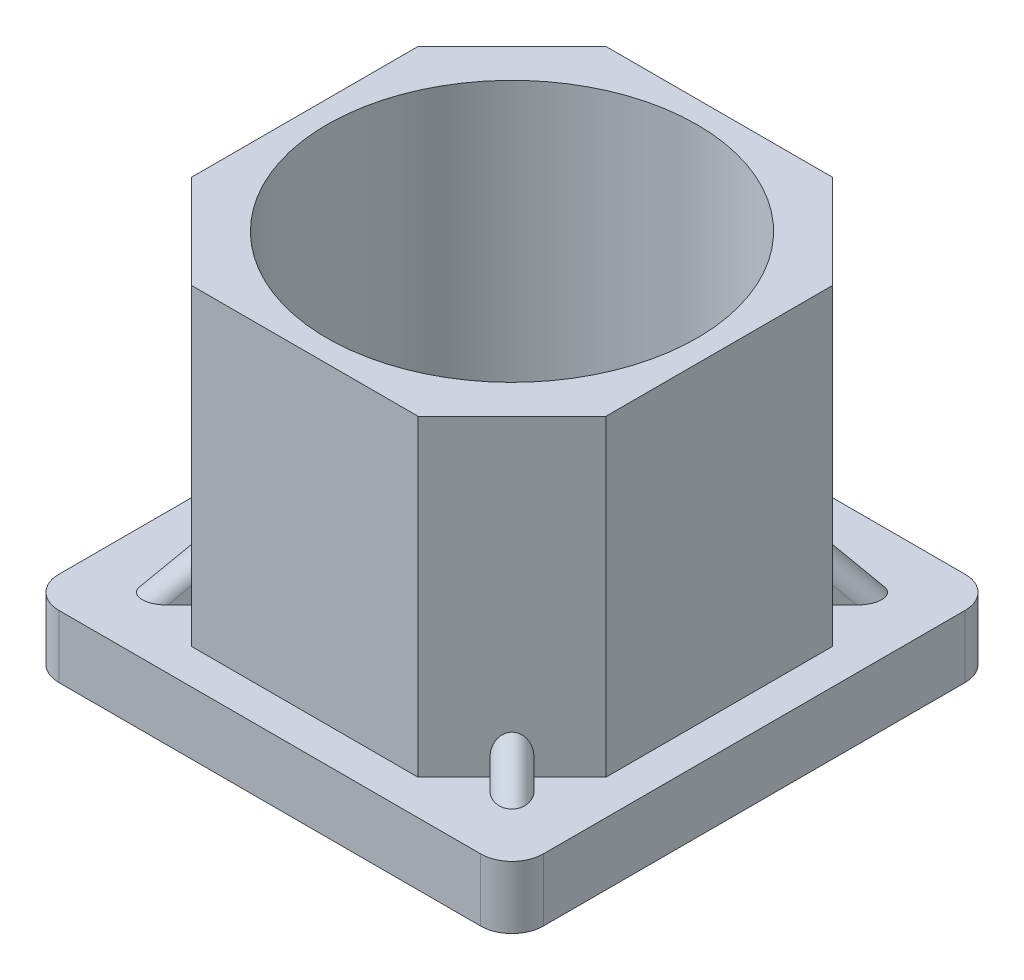
ISO-10303-21;
HEADER;
FILE_DESCRIPTION(('STEP AP214'),'2;1');
FILE_NAME('part.step','',(''),(''),'','','');
FILE_SCHEMA(('AUTOMOTIVE_DESIGN { 1 0 10303 214 1 1 1 1 }'));
ENDSEC;
DATA;
#1=APPLICATION_CONTEXT('core data for automotive mechanical design processes');
#2=APPLICATION_PROTOCOL_DEFINITION('international standard','automotive_design',2000,#1);
#3=PRODUCT_CONTEXT('',#1,'mechanical');
#4=PRODUCT('Part','Part','',(#3));
#5=PRODUCT_RELATED_PRODUCT_CATEGORY('part','',(#4));
#6=PRODUCT_DEFINITION_FORMATION('','',#4);
#7=PRODUCT_DEFINITION_CONTEXT('part definition',#1,'design');
#8=PRODUCT_DEFINITION('design','',#6,#7);
#9=PRODUCT_DEFINITION_SHAPE('','',#8);
#10=(LENGTH_UNIT() NAMED_UNIT(*) SI_UNIT(.MILLI.,.METRE.));
#11=(NAMED_UNIT(*) PLANE_ANGLE_UNIT() SI_UNIT($,.RADIAN.));
#12=(NAMED_UNIT(*) SI_UNIT($,.STERADIAN.) SOLID_ANGLE_UNIT());
#13=UNCERTAINTY_MEASURE_WITH_UNIT(LENGTH_MEASURE(1.E-05),#10,'distance_accuracy_value','');
#14=(GEOMETRIC_REPRESENTATION_CONTEXT(3) GLOBAL_UNCERTAINTY_ASSIGNED_CONTEXT((#13)) GLOBAL_UNIT_ASSIGNED_CONTEXT((#10,
#11,#12)) REPRESENTATION_CONTEXT('',''));
#15=CARTESIAN_POINT('',(0.,0.,0.));
#16=DIRECTION('',(0.,0.,1.));
#17=DIRECTION('',(1.,0.,0.));
#18=AXIS2_PLACEMENT_3D('',#15,#16,#17);
#19=CARTESIAN_POINT('',(-1.41421356237309,0.,1.41421356237309));
#20=DIRECTION('',(0.707106781186548,0.,-0.707106781186548));
#21=DIRECTION('',(-0.707106781186548,0.,-0.707106781186548));
#22=AXIS2_PLACEMENT_3D('',#19,#20,#21);
#23=PLANE('',#22);
#24=DIRECTION('',(0.500000000000015,-0.707106781186548,0.499999999999984));
#25=VECTOR('',#24,1.);
#26=CARTESIAN_POINT('',(16.4332194614999,13.9012115000335,19.2616465862462));
#27=LINE('',#26,#25);
#28=CARTESIAN_POINT('',(19.0753787975412,10.1646339330533,21.9038059222873));
#29=VERTEX_POINT('',#28);
#30=CARTESIAN_POINT('',(20.6060061303897,8.,23.4344332551358));
#31=VERTEX_POINT('',#30);
#32=EDGE_CURVE('E350',#29,#31,#27,.T.);
#33=ORIENTED_EDGE('',*,*,#32,.F.);
#34=DIRECTION('',(0.,-1.,0.));
#35=VECTOR('',#34,1.);
#36=CARTESIAN_POINT('',(19.0753787975412,48.,21.9038059222873));
#37=LINE('',#36,#35);
#38=CARTESIAN_POINT('',(19.0753787975412,8.,21.9038059222873));
#39=VERTEX_POINT('',#38);
#40=EDGE_CURVE('E358',#29,#39,#37,.T.);
#41=ORIENTED_EDGE('',*,*,#40,.T.);
#42=DIRECTION('',(0.707106781186548,0.,0.707106781186548));
#43=VECTOR('',#42,1.);
#44=CARTESIAN_POINT('',(-1.41421356237308,8.,1.41421356237309));
#45=LINE('',#44,#43);
#46=EDGE_CURVE('E341',#39,#31,#45,.T.);
#47=ORIENTED_EDGE('',*,*,#46,.T.);
#48=EDGE_LOOP('',(#33,#41,#47));
#49=FACE_BOUND('',#48,.T.);
#50=ADVANCED_FACE('F150',(#49),#23,.F.);
#51=CARTESIAN_POINT('',(1.4142135623731,0.,-1.4142135623731));
#52=DIRECTION('',(0.707106781186548,0.,-0.707106781186548));
#53=DIRECTION('',(-0.707106781186548,0.,-0.707106781186548));
#54=AXIS2_PLACEMENT_3D('',#51,#52,#53);
#55=PLANE('',#54);
#56=DIRECTION('',(0.,-1.,0.));
#57=VECTOR('',#56,1.);
#58=CARTESIAN_POINT('',(21.9038059222873,48.,19.0753787975411));
#59=LINE('',#58,#57);
#60=CARTESIAN_POINT('',(21.9038059222872,10.1646339330534,19.0753787975411));
#61=VERTEX_POINT('',#60);
#62=CARTESIAN_POINT('',(21.9038059222873,8.,19.0753787975411));
#63=VERTEX_POINT('',#62);
#64=EDGE_CURVE('E562',#61,#63,#59,.T.);
#65=ORIENTED_EDGE('',*,*,#64,.F.);
#66=DIRECTION('',(0.500000000000015,-0.707106781186548,0.499999999999984));
#67=VECTOR('',#66,1.);
#68=CARTESIAN_POINT('',(19.261646586246,13.9012115000336,16.4332194615));
#69=LINE('',#68,#67);
#70=CARTESIAN_POINT('',(23.4344332551359,8.,20.6060061303897));
#71=VERTEX_POINT('',#70);
#72=EDGE_CURVE('E693',#61,#71,#69,.T.);
#73=ORIENTED_EDGE('',*,*,#72,.T.);
#74=DIRECTION('',(0.707106781186548,0.,0.707106781186548));
#75=VECTOR('',#74,1.);
#76=CARTESIAN_POINT('',(1.4142135623731,8.,-1.4142135623731));
#77=LINE('',#76,#75);
#78=EDGE_CURVE('E344',#63,#71,#77,.T.);
#79=ORIENTED_EDGE('',*,*,#78,.F.);
#80=EDGE_LOOP('',(#65,#73,#79));
#81=FACE_BOUND('',#80,.T.);
#82=ADVANCED_FACE('F692',(#81),#55,.T.);
#83=CARTESIAN_POINT('',(-26.99,8.,26.99));
#84=DIRECTION('',(0.,-1.,0.));
#85=DIRECTION('',(0.,0.,-1.));
#86=AXIS2_PLACEMENT_3D('',#83,#84,#85);
#87=PLANE('',#86);
#88=CARTESIAN_POINT('',(22.0202196927625,8.,22.0202196927629));
#89=DIRECTION('',(0.,-1.,0.));
#90=DIRECTION('',(-0.707106781186569,0.,-0.707106781186526));
#91=AXIS2_PLACEMENT_3D('',#88,#89,#90);
#92=ELLIPSE('',#91,2.82842712474614,1.99999999999997);
#93=EDGE_CURVE('E336',#71,#31,#92,.T.);
#94=ORIENTED_EDGE('',*,*,#93,.T.);
#95=ORIENTED_EDGE('',*,*,#46,.F.);
#96=DIRECTION('',(0.707106781186526,0.,-0.707106781186569));
#97=VECTOR('',#96,1.);
#98=CARTESIAN_POINT('',(26.4999999999998,8.,14.4791847198283));
#99=LINE('',#98,#97);
#100=CARTESIAN_POINT('',(14.4791847198288,8.,26.5));
#101=VERTEX_POINT('',#100);
#102=EDGE_CURVE('E416',#101,#39,#99,.T.);
#103=ORIENTED_EDGE('',*,*,#102,.F.);
#104=DIRECTION('',(1.,0.,0.));
#105=VECTOR('',#104,1.);
#106=CARTESIAN_POINT('',(-14.4791847198286,8.,26.5));
#107=LINE('',#106,#105);
#108=CARTESIAN_POINT('',(-14.4791847198286,8.,26.5));
#109=VERTEX_POINT('',#108);
#110=EDGE_CURVE('E411',#109,#101,#107,.T.);
#111=ORIENTED_EDGE('',*,*,#110,.F.);
#112=DIRECTION('',(0.70710678118655,0.,0.707106781186545));
#113=VECTOR('',#112,1.);
#114=CARTESIAN_POINT('',(-14.4791847198286,8.,26.5));
#115=LINE('',#114,#113);
#116=CARTESIAN_POINT('',(-19.0753787975409,8.,21.9038059222877));
#117=VERTEX_POINT('',#116);
#118=EDGE_CURVE('E406',#117,#109,#115,.T.);
#119=ORIENTED_EDGE('',*,*,#118,.F.);
#120=DIRECTION('',(-0.707106781186536,0.,0.707106781186559));
#121=VECTOR('',#120,1.);
#122=CARTESIAN_POINT('',(-25.5757864376265,8.,28.4042135623735));
#123=LINE('',#122,#121);
#124=CARTESIAN_POINT('',(-20.6097393284398,8.,23.4381664531867));
#125=VERTEX_POINT('',#124);
#126=EDGE_CURVE('E635',#117,#125,#123,.T.);
#127=ORIENTED_EDGE('',*,*,#126,.T.);
#128=CARTESIAN_POINT('',(-22.0239528908132,8.,22.0239528908134));
#129=DIRECTION('',(0.,-1.,0.));
#130=DIRECTION('',(0.707106781186545,0.,-0.70710678118655));
#131=AXIS2_PLACEMENT_3D('',#128,#129,#130);
#132=ELLIPSE('',#131,2.82842712474621,2.00000000000001);
#133=CARTESIAN_POINT('',(-23.4381664531861,8.,20.6097393284405));
#134=VERTEX_POINT('',#133);
#135=EDGE_CURVE('E167',#134,#125,#132,.F.);
#136=ORIENTED_EDGE('',*,*,#135,.F.);
#137=DIRECTION('',(-0.707106781186536,0.,0.707106781186559));
#138=VECTOR('',#137,1.);
#139=CARTESIAN_POINT('',(-28.4042135623727,8.,25.5757864376273));
#140=LINE('',#139,#138);
#141=CARTESIAN_POINT('',(-21.9038059222871,8.,19.0753787975416));
#142=VERTEX_POINT('',#141);
#143=EDGE_CURVE('E631',#142,#134,#140,.T.);
#144=ORIENTED_EDGE('',*,*,#143,.F.);
#145=CARTESIAN_POINT('',(-26.5,8.,14.4791847198287));
#146=VERTEX_POINT('',#145);
#147=EDGE_CURVE('E407',#146,#142,#115,.T.);
#148=ORIENTED_EDGE('',*,*,#147,.F.);
#149=DIRECTION('',(0.,0.,1.));
#150=VECTOR('',#149,1.);
#151=CARTESIAN_POINT('',(-26.5,8.,14.4791847198287));
#152=LINE('',#151,#150);
#153=CARTESIAN_POINT('',(-26.5,8.,-14.4791847198287));
#154=VERTEX_POINT('',#153);
#155=EDGE_CURVE('E402',#154,#146,#152,.T.);
#156=ORIENTED_EDGE('',*,*,#155,.F.);
#157=DIRECTION('',(-0.707106781186548,0.,0.707106781186548));
#158=VECTOR('',#157,1.);
#159=CARTESIAN_POINT('',(-26.5,8.,-14.4791847198287));
#160=LINE('',#159,#158);
#161=CARTESIAN_POINT('',(-21.9038059222875,8.,-19.0753787975413));
#162=VERTEX_POINT('',#161);
#163=EDGE_CURVE('E432',#162,#154,#160,.T.);
#164=ORIENTED_EDGE('',*,*,#163,.F.);
#165=DIRECTION('',(-0.707106781186548,0.,-0.707106781186547));
#166=VECTOR('',#165,1.);
#167=CARTESIAN_POINT('',(-26.8535533905933,8.,-24.0251262658471));
#168=LINE('',#167,#166);
#169=CARTESIAN_POINT('',(-23.1591134094628,8.,-20.3306862847166));
#170=VERTEX_POINT('',#169);
#171=EDGE_CURVE('E372',#162,#170,#168,.T.);
#172=ORIENTED_EDGE('',*,*,#171,.T.);
#173=CARTESIAN_POINT('',(-21.6452395452023,8.,-21.6452395452023));
#174=DIRECTION('',(0.,-1.,0.));
#175=DIRECTION('',(0.707106781186547,0.,0.707106781186548));
#176=AXIS2_PLACEMENT_3D('',#173,#174,#175);
#177=ELLIPSE('',#176,2.83193650203267,2.00248150447701);
#178=CARTESIAN_POINT('',(-20.3306862847187,8.,-23.1591134094649));
#179=VERTEX_POINT('',#178);
#180=EDGE_CURVE('E654',#179,#170,#177,.F.);
#181=ORIENTED_EDGE('',*,*,#180,.F.);
#182=DIRECTION('',(-0.707106781186548,0.,-0.707106781186547));
#183=VECTOR('',#182,1.);
#184=CARTESIAN_POINT('',(-24.0251262658471,8.,-26.8535533905933));
#185=LINE('',#184,#183);
#186=CARTESIAN_POINT('',(-19.0753787975413,8.,-21.9038059222874));
#187=VERTEX_POINT('',#186);
#188=EDGE_CURVE('E361',#187,#179,#185,.T.);
#189=ORIENTED_EDGE('',*,*,#188,.F.);
#190=CARTESIAN_POINT('',(-14.4791847198287,8.,-26.5));
#191=VERTEX_POINT('',#190);
#192=EDGE_CURVE('E380',#191,#187,#160,.T.);
#193=ORIENTED_EDGE('',*,*,#192,.F.);
#194=DIRECTION('',(-1.,0.,0.));
#195=VECTOR('',#194,1.);
#196=CARTESIAN_POINT('',(-14.4791847198287,8.,-26.5));
#197=LINE('',#196,#195);
#198=CARTESIAN_POINT('',(14.4791847198285,8.,-26.5));
#199=VERTEX_POINT('',#198);
#200=EDGE_CURVE('E428',#199,#191,#197,.T.);
#201=ORIENTED_EDGE('',*,*,#200,.F.);
#202=DIRECTION('',(-0.707106781186546,0.,-0.70710678118655));
#203=VECTOR('',#202,1.);
#204=CARTESIAN_POINT('',(14.4791847198285,8.,-26.5));
#205=LINE('',#204,#203);
#206=CARTESIAN_POINT('',(19.0753787975408,8.,-21.9038059222876));
#207=VERTEX_POINT('',#206);
#208=EDGE_CURVE('E423',#207,#199,#205,.T.);
#209=ORIENTED_EDGE('',*,*,#208,.F.);
#210=DIRECTION('',(0.707106781186537,0.,-0.707106781186558));
#211=VECTOR('',#210,1.);
#212=CARTESIAN_POINT('',(-28.4042135623727,8.,25.5757864376273));
#213=LINE('',#212,#211);
#214=CARTESIAN_POINT('',(20.6579585078633,8.,-23.4863856326102));
#215=VERTEX_POINT('',#214);
#216=EDGE_CURVE('E584',#207,#215,#213,.T.);
#217=ORIENTED_EDGE('',*,*,#216,.T.);
#218=CARTESIAN_POINT('',(22.0233572580345,8.,-22.0233572580343));
#219=DIRECTION('',(0.,-1.,0.));
#220=DIRECTION('',(-0.70710678118655,0.,0.707106781186546));
#221=AXIS2_PLACEMENT_3D('',#218,#219,#220);
#222=ELLIPSE('',#221,2.82926947669985,2.00059563277858);
#223=CARTESIAN_POINT('',(23.4863856326564,8.,-20.6579585079108));
#224=VERTEX_POINT('',#223);
#225=EDGE_CURVE('E174',#224,#215,#222,.F.);
#226=ORIENTED_EDGE('',*,*,#225,.F.);
#227=DIRECTION('',(0.707106781186537,0.,-0.707106781186558));
#228=VECTOR('',#227,1.);
#229=CARTESIAN_POINT('',(-25.5757864376265,8.,28.4042135623735));
#230=LINE('',#229,#228);
#231=CARTESIAN_POINT('',(21.903805922287,8.,-19.0753787975415));
#232=VERTEX_POINT('',#231);
#233=EDGE_CURVE('E588',#232,#224,#230,.T.);
#234=ORIENTED_EDGE('',*,*,#233,.F.);
#235=CARTESIAN_POINT('',(26.4999999999998,8.,-14.4791847198287));
#236=VERTEX_POINT('',#235);
#237=EDGE_CURVE('E424',#236,#232,#205,.T.);
#238=ORIENTED_EDGE('',*,*,#237,.F.);
#239=DIRECTION('',(0.,0.,-1.));
#240=VECTOR('',#239,1.);
#241=CARTESIAN_POINT('',(26.4999999999998,8.,14.4791847198283));
#242=LINE('',#241,#240);
#243=CARTESIAN_POINT('',(26.4999999999998,8.,14.4791847198283));
#244=VERTEX_POINT('',#243);
#245=EDGE_CURVE('E419',#244,#236,#242,.T.);
#246=ORIENTED_EDGE('',*,*,#245,.F.);
#247=EDGE_CURVE('E415',#63,#244,#99,.T.);
#248=ORIENTED_EDGE('',*,*,#247,.F.);
#249=ORIENTED_EDGE('',*,*,#78,.T.);
#250=EDGE_LOOP('',(#94,#95,#103,#111,#119,#127,#136,#144,#148,#156,#164,#172,#181,#189,#193,
#201,#209,#217,#226,#234,#238,#246,#248,#249));
#251=FACE_BOUND('',#250,.T.);
#252=CARTESIAN_POINT('',(-26.99,8.,26.99));
#253=DIRECTION('',(0.,1.,0.));
#254=DIRECTION('',(0.,0.,-1.));
#255=AXIS2_PLACEMENT_3D('',#252,#253,#254);
#256=CIRCLE('',#255,4.);
#257=CARTESIAN_POINT('',(-30.99,8.,26.99));
#258=VERTEX_POINT('',#257);
#259=CARTESIAN_POINT('',(-26.99,8.,30.99));
#260=VERTEX_POINT('',#259);
#261=EDGE_CURVE('E468',#258,#260,#256,.T.);
#262=ORIENTED_EDGE('',*,*,#261,.T.);
#263=DIRECTION('',(1.,0.,0.));
#264=VECTOR('',#263,1.);
#265=CARTESIAN_POINT('',(-26.99,8.,30.99));
#266=LINE('',#265,#264);
#267=CARTESIAN_POINT('',(26.99,8.,30.99));
#268=VERTEX_POINT('',#267);
#269=EDGE_CURVE('E472',#260,#268,#266,.T.);
#270=ORIENTED_EDGE('',*,*,#269,.T.);
#271=CARTESIAN_POINT('',(26.99,8.,26.99));
#272=DIRECTION('',(0.,1.,0.));
#273=DIRECTION('',(0.,0.,1.));
#274=AXIS2_PLACEMENT_3D('',#271,#272,#273);
#275=CIRCLE('',#274,3.99999999999999);
#276=CARTESIAN_POINT('',(30.99,8.,26.99));
#277=VERTEX_POINT('',#276);
#278=EDGE_CURVE('E476',#268,#277,#275,.T.);
#279=ORIENTED_EDGE('',*,*,#278,.T.);
#280=DIRECTION('',(0.,0.,-1.));
#281=VECTOR('',#280,1.);
#282=CARTESIAN_POINT('',(30.99,8.,26.99));
#283=LINE('',#282,#281);
#284=CARTESIAN_POINT('',(30.99,8.,-26.99));
#285=VERTEX_POINT('',#284);
#286=EDGE_CURVE('E479',#277,#285,#283,.T.);
#287=ORIENTED_EDGE('',*,*,#286,.T.);
#288=CARTESIAN_POINT('',(26.99,8.,-26.99));
#289=DIRECTION('',(0.,1.,0.));
#290=DIRECTION('',(0.,0.,-1.));
#291=AXIS2_PLACEMENT_3D('',#288,#289,#290);
#292=CIRCLE('',#291,4.);
#293=CARTESIAN_POINT('',(26.99,8.,-30.99));
#294=VERTEX_POINT('',#293);
#295=EDGE_CURVE('E482',#285,#294,#292,.T.);
#296=ORIENTED_EDGE('',*,*,#295,.T.);
#297=DIRECTION('',(-1.,0.,0.));
#298=VECTOR('',#297,1.);
#299=CARTESIAN_POINT('',(-26.99,8.,-30.99));
#300=LINE('',#299,#298);
#301=CARTESIAN_POINT('',(-26.99,8.,-30.99));
#302=VERTEX_POINT('',#301);
#303=EDGE_CURVE('E485',#294,#302,#300,.T.);
#304=ORIENTED_EDGE('',*,*,#303,.T.);
#305=CARTESIAN_POINT('',(-26.99,8.,-26.99));
#306=DIRECTION('',(0.,1.,0.));
#307=DIRECTION('',(0.,0.,-1.));
#308=AXIS2_PLACEMENT_3D('',#305,#306,#307);
#309=CIRCLE('',#308,4.);
#310=CARTESIAN_POINT('',(-30.99,8.,-26.99));
#311=VERTEX_POINT('',#310);
#312=EDGE_CURVE('E488',#302,#311,#309,.T.);
#313=ORIENTED_EDGE('',*,*,#312,.T.);
#314=DIRECTION('',(0.,0.,1.));
#315=VECTOR('',#314,1.);
#316=CARTESIAN_POINT('',(-30.99,8.,26.99));
#317=LINE('',#316,#315);
#318=EDGE_CURVE('E491',#311,#258,#317,.T.);
#319=ORIENTED_EDGE('',*,*,#318,.T.);
#320=EDGE_LOOP('',(#262,#270,#279,#287,#296,#304,#313,#319));
#321=FACE_BOUND('',#320,.T.);
#322=ADVANCED_FACE('F338',(#251,#321),#87,.F.);
#323=CARTESIAN_POINT('',(14.4791847198285,48.,-26.5));
#324=DIRECTION('',(-0.70710678118655,0.,0.707106781186546));
#325=DIRECTION('',(0.707106781186546,0.,0.70710678118655));
#326=AXIS2_PLACEMENT_3D('',#323,#324,#325);
#327=PLANE('',#326);
#328=CARTESIAN_POINT('',(20.4895923599143,10.1690711204133,-20.4895923599142));
#329=DIRECTION('',(-0.70710678118655,0.,0.707106781186546));
#330=DIRECTION('',(0.,-1.,0.));
#331=AXIS2_PLACEMENT_3D('',#328,#329,#330);
#332=ELLIPSE('',#331,2.82926947669985,2.00059563277858);
#333=CARTESIAN_POINT('',(21.903805922287,10.2381056899408,-19.0753787975415));
#334=VERTEX_POINT('',#333);
#335=CARTESIAN_POINT('',(19.0753787975408,10.2381056898746,-21.9038059222877));
#336=VERTEX_POINT('',#335);
#337=EDGE_CURVE('E580',#334,#336,#332,.T.);
#338=ORIENTED_EDGE('',*,*,#337,.T.);
#339=DIRECTION('',(0.,-1.,0.));
#340=VECTOR('',#339,1.);
#341=CARTESIAN_POINT('',(19.0753787975408,48.,-21.9038059222877));
#342=LINE('',#341,#340);
#343=EDGE_CURVE('E160',#336,#207,#342,.T.);
#344=ORIENTED_EDGE('',*,*,#343,.T.);
#345=ORIENTED_EDGE('',*,*,#208,.T.);
#346=DIRECTION('',(0.,-1.,0.));
#347=VECTOR('',#346,1.);
#348=CARTESIAN_POINT('',(14.4791847198285,48.,-26.5));
#349=LINE('',#348,#347);
#350=CARTESIAN_POINT('',(14.4791847198285,48.,-26.5));
#351=VERTEX_POINT('',#350);
#352=EDGE_CURVE('E443',#351,#199,#349,.T.);
#353=ORIENTED_EDGE('',*,*,#352,.F.);
#354=DIRECTION('',(-0.707106781186546,0.,-0.70710678118655));
#355=VECTOR('',#354,1.);
#356=CARTESIAN_POINT('',(14.4791847198285,48.,-26.5));
#357=LINE('',#356,#355);
#358=CARTESIAN_POINT('',(26.4999999999998,48.,-14.4791847198287));
#359=VERTEX_POINT('',#358);
#360=EDGE_CURVE('E392',#359,#351,#357,.T.);
#361=ORIENTED_EDGE('',*,*,#360,.F.);
#362=DIRECTION('',(0.,-1.,0.));
#363=VECTOR('',#362,1.);
#364=CARTESIAN_POINT('',(26.4999999999998,48.,-14.4791847198287));
#365=LINE('',#364,#363);
#366=EDGE_CURVE('E447',#359,#236,#365,.T.);
#367=ORIENTED_EDGE('',*,*,#366,.T.);
#368=ORIENTED_EDGE('',*,*,#237,.T.);
#369=DIRECTION('',(0.,-1.,0.));
#370=VECTOR('',#369,1.);
#371=CARTESIAN_POINT('',(21.903805922287,48.,-19.0753787975415));
#372=LINE('',#371,#370);
#373=EDGE_CURVE('E12',#334,#232,#372,.T.);
#374=ORIENTED_EDGE('',*,*,#373,.F.);
#375=EDGE_LOOP('',(#338,#344,#345,#353,#361,#367,#368,#374));
#376=FACE_BOUND('',#375,.T.);
#377=ADVANCED_FACE('F575',(#376),#327,.F.);
#378=CARTESIAN_POINT('',(-26.99,8.,26.99));
#379=DIRECTION('',(0.,-1.,0.));
#380=DIRECTION('',(0.,0.,-1.));
#381=AXIS2_PLACEMENT_3D('',#378,#379,#380);
#382=CYLINDRICAL_SURFACE('',#381,4.);
#383=CARTESIAN_POINT('',(-26.99,0.,26.99));
#384=DIRECTION('',(0.,1.,0.));
#385=DIRECTION('',(0.,0.,-1.));
#386=AXIS2_PLACEMENT_3D('',#383,#384,#385);
#387=CIRCLE('',#386,4.);
#388=CARTESIAN_POINT('',(-30.99,0.,26.99));
#389=VERTEX_POINT('',#388);
#390=CARTESIAN_POINT('',(-26.99,0.,30.99));
#391=VERTEX_POINT('',#390);
#392=EDGE_CURVE('E467',#389,#391,#387,.T.);
#393=ORIENTED_EDGE('',*,*,#392,.T.);
#394=DIRECTION('',(0.,-1.,0.));
#395=VECTOR('',#394,1.);
#396=CARTESIAN_POINT('',(-26.99,8.,30.99));
#397=LINE('',#396,#395);
#398=EDGE_CURVE('E545',#260,#391,#397,.T.);
#399=ORIENTED_EDGE('',*,*,#398,.F.);
#400=ORIENTED_EDGE('',*,*,#261,.F.);
#401=DIRECTION('',(0.,-1.,0.));
#402=VECTOR('',#401,1.);
#403=CARTESIAN_POINT('',(-30.99,8.,26.99));
#404=LINE('',#403,#402);
#405=EDGE_CURVE('E494',#258,#389,#404,.T.);
#406=ORIENTED_EDGE('',*,*,#405,.T.);
#407=EDGE_LOOP('',(#393,#399,#400,#406));
#408=FACE_BOUND('',#407,.T.);
#409=ADVANCED_FACE('F989',(#408),#382,.T.);
#410=CARTESIAN_POINT('',(-26.99,8.,30.99));
#411=DIRECTION('',(0.,0.,-1.));
#412=DIRECTION('',(-1.,0.,0.));
#413=AXIS2_PLACEMENT_3D('',#410,#411,#412);
#414=PLANE('',#413);
#415=DIRECTION('',(1.,0.,0.));
#416=VECTOR('',#415,1.);
#417=CARTESIAN_POINT('',(-26.99,0.,30.99));
#418=LINE('',#417,#416);
#419=CARTESIAN_POINT('',(26.99,0.,30.99));
#420=VERTEX_POINT('',#419);
#421=EDGE_CURVE('E498',#391,#420,#418,.T.);
#422=ORIENTED_EDGE('',*,*,#421,.T.);
#423=DIRECTION('',(0.,-1.,0.));
#424=VECTOR('',#423,1.);
#425=CARTESIAN_POINT('',(26.99,8.,30.99));
#426=LINE('',#425,#424);
#427=EDGE_CURVE('E541',#268,#420,#426,.T.);
#428=ORIENTED_EDGE('',*,*,#427,.F.);
#429=ORIENTED_EDGE('',*,*,#269,.F.);
#430=ORIENTED_EDGE('',*,*,#398,.T.);
#431=EDGE_LOOP('',(#422,#428,#429,#430));
#432=FACE_BOUND('',#431,.T.);
#433=ADVANCED_FACE('F1106',(#432),#414,.F.);
#434=CARTESIAN_POINT('',(26.99,8.,26.99));
#435=DIRECTION('',(0.,-1.,0.));
#436=DIRECTION('',(0.,0.,-1.));
#437=AXIS2_PLACEMENT_3D('',#434,#435,#436);
#438=CYLINDRICAL_SURFACE('',#437,3.99999999999999);
#439=CARTESIAN_POINT('',(26.99,0.,26.99));
#440=DIRECTION('',(0.,1.,0.));
#441=DIRECTION('',(0.,0.,1.));
#442=AXIS2_PLACEMENT_3D('',#439,#440,#441);
#443=CIRCLE('',#442,3.99999999999999);
#444=CARTESIAN_POINT('',(30.99,0.,26.99));
#445=VERTEX_POINT('',#444);
#446=EDGE_CURVE('E501',#420,#445,#443,.T.);
#447=ORIENTED_EDGE('',*,*,#446,.T.);
#448=DIRECTION('',(0.,-1.,0.));
#449=VECTOR('',#448,1.);
#450=CARTESIAN_POINT('',(30.99,8.,26.99));
#451=LINE('',#450,#449);
#452=EDGE_CURVE('E537',#277,#445,#451,.T.);
#453=ORIENTED_EDGE('',*,*,#452,.F.);
#454=ORIENTED_EDGE('',*,*,#278,.F.);
#455=ORIENTED_EDGE('',*,*,#427,.T.);
#456=EDGE_LOOP('',(#447,#453,#454,#455));
#457=FACE_BOUND('',#456,.T.);
#458=ADVANCED_FACE('F1095',(#457),#438,.T.);
#459=CARTESIAN_POINT('',(30.99,8.,26.99));
#460=DIRECTION('',(-1.,0.,0.));
#461=DIRECTION('',(0.,0.,1.));
#462=AXIS2_PLACEMENT_3D('',#459,#460,#461);
#463=PLANE('',#462);
#464=DIRECTION('',(0.,0.,-1.));
#465=VECTOR('',#464,1.);
#466=CARTESIAN_POINT('',(30.99,0.,26.99));
#467=LINE('',#466,#465);
#468=CARTESIAN_POINT('',(30.99,0.,-26.99));
#469=VERTEX_POINT('',#468);
#470=EDGE_CURVE('E504',#445,#469,#467,.T.);
#471=ORIENTED_EDGE('',*,*,#470,.T.);
#472=DIRECTION('',(0.,-1.,0.));
#473=VECTOR('',#472,1.);
#474=CARTESIAN_POINT('',(30.99,8.,-26.99));
#475=LINE('',#474,#473);
#476=EDGE_CURVE('E533',#285,#469,#475,.T.);
#477=ORIENTED_EDGE('',*,*,#476,.F.);
#478=ORIENTED_EDGE('',*,*,#286,.F.);
#479=ORIENTED_EDGE('',*,*,#452,.T.);
#480=EDGE_LOOP('',(#471,#477,#478,#479));
#481=FACE_BOUND('',#480,.T.);
#482=ADVANCED_FACE('F1084',(#481),#463,.F.);
#483=CARTESIAN_POINT('',(26.99,8.,-26.99));
#484=DIRECTION('',(0.,-1.,0.));
#485=DIRECTION('',(0.,0.,-1.));
#486=AXIS2_PLACEMENT_3D('',#483,#484,#485);
#487=CYLINDRICAL_SURFACE('',#486,4.);
#488=CARTESIAN_POINT('',(26.99,0.,-26.99));
#489=DIRECTION('',(0.,1.,0.));
#490=DIRECTION('',(0.,0.,-1.));
#491=AXIS2_PLACEMENT_3D('',#488,#489,#490);
#492=CIRCLE('',#491,4.);
#493=CARTESIAN_POINT('',(26.99,0.,-30.99));
#494=VERTEX_POINT('',#493);
#495=EDGE_CURVE('E507',#469,#494,#492,.T.);
#496=ORIENTED_EDGE('',*,*,#495,.T.);
#497=DIRECTION('',(0.,-1.,0.));
#498=VECTOR('',#497,1.);
#499=CARTESIAN_POINT('',(26.99,8.,-30.99));
#500=LINE('',#499,#498);
#501=EDGE_CURVE('E529',#294,#494,#500,.T.);
#502=ORIENTED_EDGE('',*,*,#501,.F.);
#503=ORIENTED_EDGE('',*,*,#295,.F.);
#504=ORIENTED_EDGE('',*,*,#476,.T.);
#505=EDGE_LOOP('',(#496,#502,#503,#504));
#506=FACE_BOUND('',#505,.T.);
#507=ADVANCED_FACE('F1073',(#506),#487,.T.);
#508=CARTESIAN_POINT('',(-26.99,8.,-30.99));
#509=DIRECTION('',(0.,0.,1.));
#510=DIRECTION('',(1.,0.,0.));
#511=AXIS2_PLACEMENT_3D('',#508,#509,#510);
#512=PLANE('',#511);
#513=DIRECTION('',(-1.,0.,0.));
#514=VECTOR('',#513,1.);
#515=CARTESIAN_POINT('',(-26.99,0.,-30.99));
#516=LINE('',#515,#514);
#517=CARTESIAN_POINT('',(-26.99,0.,-30.99));
#518=VERTEX_POINT('',#517);
#519=EDGE_CURVE('E510',#494,#518,#516,.T.);
#520=ORIENTED_EDGE('',*,*,#519,.T.);
#521=DIRECTION('',(0.,-1.,0.));
#522=VECTOR('',#521,1.);
#523=CARTESIAN_POINT('',(-26.99,8.,-30.99));
#524=LINE('',#523,#522);
#525=EDGE_CURVE('E525',#302,#518,#524,.T.);
#526=ORIENTED_EDGE('',*,*,#525,.F.);
#527=ORIENTED_EDGE('',*,*,#303,.F.);
#528=ORIENTED_EDGE('',*,*,#501,.T.);
#529=EDGE_LOOP('',(#520,#526,#527,#528));
#530=FACE_BOUND('',#529,.T.);
#531=ADVANCED_FACE('F1062',(#530),#512,.F.);
#532=CARTESIAN_POINT('',(-26.99,8.,-26.99));
#533=DIRECTION('',(0.,-1.,0.));
#534=DIRECTION('',(0.,0.,-1.));
#535=AXIS2_PLACEMENT_3D('',#532,#533,#534);
#536=CYLINDRICAL_SURFACE('',#535,4.);
#537=CARTESIAN_POINT('',(-26.99,0.,-26.99));
#538=DIRECTION('',(0.,1.,0.));
#539=DIRECTION('',(0.,0.,-1.));
#540=AXIS2_PLACEMENT_3D('',#537,#538,#539);
#541=CIRCLE('',#540,4.);
#542=CARTESIAN_POINT('',(-30.99,0.,-26.99));
#543=VERTEX_POINT('',#542);
#544=EDGE_CURVE('E513',#518,#543,#541,.T.);
#545=ORIENTED_EDGE('',*,*,#544,.T.);
#546=DIRECTION('',(0.,-1.,0.));
#547=VECTOR('',#546,1.);
#548=CARTESIAN_POINT('',(-30.99,8.,-26.99));
#549=LINE('',#548,#547);
#550=EDGE_CURVE('E521',#311,#543,#549,.T.);
#551=ORIENTED_EDGE('',*,*,#550,.F.);
#552=ORIENTED_EDGE('',*,*,#312,.F.);
#553=ORIENTED_EDGE('',*,*,#525,.T.);
#554=EDGE_LOOP('',(#545,#551,#552,#553));
#555=FACE_BOUND('',#554,.T.);
#556=ADVANCED_FACE('F1051',(#555),#536,.T.);
#557=CARTESIAN_POINT('',(-30.99,8.,26.99));
#558=DIRECTION('',(1.,0.,0.));
#559=DIRECTION('',(0.,0.,-1.));
#560=AXIS2_PLACEMENT_3D('',#557,#558,#559);
#561=PLANE('',#560);
#562=DIRECTION('',(0.,0.,1.));
#563=VECTOR('',#562,1.);
#564=CARTESIAN_POINT('',(-30.99,0.,26.99));
#565=LINE('',#564,#563);
#566=EDGE_CURVE('E473',#543,#389,#565,.T.);
#567=ORIENTED_EDGE('',*,*,#566,.T.);
#568=ORIENTED_EDGE('',*,*,#405,.F.);
#569=ORIENTED_EDGE('',*,*,#318,.F.);
#570=ORIENTED_EDGE('',*,*,#550,.T.);
#571=EDGE_LOOP('',(#567,#568,#569,#570));
#572=FACE_BOUND('',#571,.T.);
#573=ADVANCED_FACE('F1008',(#572),#561,.F.);
#574=CARTESIAN_POINT('',(-26.99,0.,26.99));
#575=DIRECTION('',(0.,-1.,0.));
#576=DIRECTION('',(0.,0.,-1.));
#577=AXIS2_PLACEMENT_3D('',#574,#575,#576);
#578=PLANE('',#577);
#579=CARTESIAN_POINT('',(0.,0.,0.));
#580=DIRECTION('',(0.,-1.,0.));
#581=DIRECTION('',(0.,0.,-1.));
#582=AXIS2_PLACEMENT_3D('',#579,#580,#581);
#583=CIRCLE('',#582,25.42);
#584=CARTESIAN_POINT('',(0.,0.,-25.42));
#585=VERTEX_POINT('',#584);
#586=EDGE_CURVE('E549',#585,#585,#583,.F.);
#587=ORIENTED_EDGE('',*,*,#586,.T.);
#588=EDGE_LOOP('',(#587));
#589=FACE_BOUND('',#588,.T.);
#590=ORIENTED_EDGE('',*,*,#392,.F.);
#591=ORIENTED_EDGE('',*,*,#566,.F.);
#592=ORIENTED_EDGE('',*,*,#544,.F.);
#593=ORIENTED_EDGE('',*,*,#519,.F.);
#594=ORIENTED_EDGE('',*,*,#495,.F.);
#595=ORIENTED_EDGE('',*,*,#470,.F.);
#596=ORIENTED_EDGE('',*,*,#446,.F.);
#597=ORIENTED_EDGE('',*,*,#421,.F.);
#598=EDGE_LOOP('',(#590,#591,#592,#593,#594,#595,#596,#597));
#599=FACE_BOUND('',#598,.T.);
#600=ADVANCED_FACE('F1003',(#589,#599),#578,.T.);
#601=CARTESIAN_POINT('',(-26.5,48.,14.4791847198287));
#602=DIRECTION('',(1.,0.,0.));
#603=DIRECTION('',(0.,0.,-1.));
#604=AXIS2_PLACEMENT_3D('',#601,#602,#603);
#605=PLANE('',#604);
#606=ORIENTED_EDGE('',*,*,#155,.T.);
#607=DIRECTION('',(0.,-1.,0.));
#608=VECTOR('',#607,1.);
#609=CARTESIAN_POINT('',(-26.5,48.,14.4791847198287));
#610=LINE('',#609,#608);
#611=CARTESIAN_POINT('',(-26.5,48.,14.4791847198287));
#612=VERTEX_POINT('',#611);
#613=EDGE_CURVE('E463',#612,#146,#610,.T.);
#614=ORIENTED_EDGE('',*,*,#613,.F.);
#615=DIRECTION('',(0.,0.,1.));
#616=VECTOR('',#615,1.);
#617=CARTESIAN_POINT('',(-26.5,48.,14.4791847198287));
#618=LINE('',#617,#616);
#619=CARTESIAN_POINT('',(-26.5,48.,-14.4791847198287));
#620=VERTEX_POINT('',#619);
#621=EDGE_CURVE('E375',#620,#612,#618,.T.);
#622=ORIENTED_EDGE('',*,*,#621,.F.);
#623=DIRECTION('',(0.,-1.,0.));
#624=VECTOR('',#623,1.);
#625=CARTESIAN_POINT('',(-26.5,48.,-14.4791847198287));
#626=LINE('',#625,#624);
#627=EDGE_CURVE('E401',#620,#154,#626,.T.);
#628=ORIENTED_EDGE('',*,*,#627,.T.);
#629=EDGE_LOOP('',(#606,#614,#622,#628));
#630=FACE_BOUND('',#629,.T.);
#631=ADVANCED_FACE('F625',(#630),#605,.F.);
#632=CARTESIAN_POINT('',(-14.4791847198286,48.,26.5));
#633=DIRECTION('',(0.707106781186545,0.,-0.70710678118655));
#634=DIRECTION('',(-0.70710678118655,0.,-0.707106781186545));
#635=AXIS2_PLACEMENT_3D('',#632,#633,#634);
#636=PLANE('',#635);
#637=CARTESIAN_POINT('',(-20.4895923599142,10.1699134723673,20.4895923599144));
#638=DIRECTION('',(0.707106781186545,0.,-0.70710678118655));
#639=DIRECTION('',(0.,-1.,0.));
#640=AXIS2_PLACEMENT_3D('',#637,#638,#639);
#641=ELLIPSE('',#640,2.82842712474621,2.00000000000001);
#642=CARTESIAN_POINT('',(-21.9038059222871,10.1699134723673,19.0753787975416));
#643=VERTEX_POINT('',#642);
#644=CARTESIAN_POINT('',(-19.0753787975409,10.1699134723672,21.9038059222878));
#645=VERTEX_POINT('',#644);
#646=EDGE_CURVE('E706',#643,#645,#641,.T.);
#647=ORIENTED_EDGE('',*,*,#646,.T.);
#648=DIRECTION('',(0.,-1.,0.));
#649=VECTOR('',#648,1.);
#650=CARTESIAN_POINT('',(-19.0753787975409,48.,21.9038059222877));
#651=LINE('',#650,#649);
#652=EDGE_CURVE('E568',#645,#117,#651,.T.);
#653=ORIENTED_EDGE('',*,*,#652,.T.);
#654=ORIENTED_EDGE('',*,*,#118,.T.);
#655=DIRECTION('',(0.,-1.,0.));
#656=VECTOR('',#655,1.);
#657=CARTESIAN_POINT('',(-14.4791847198286,48.,26.5));
#658=LINE('',#657,#656);
#659=CARTESIAN_POINT('',(-14.4791847198286,48.,26.5));
#660=VERTEX_POINT('',#659);
#661=EDGE_CURVE('E459',#660,#109,#658,.T.);
#662=ORIENTED_EDGE('',*,*,#661,.F.);
#663=DIRECTION('',(0.70710678118655,0.,0.707106781186545));
#664=VECTOR('',#663,1.);
#665=CARTESIAN_POINT('',(-14.4791847198286,48.,26.5));
#666=LINE('',#665,#664);
#667=EDGE_CURVE('E379',#612,#660,#666,.T.);
#668=ORIENTED_EDGE('',*,*,#667,.F.);
#669=ORIENTED_EDGE('',*,*,#613,.T.);
#670=ORIENTED_EDGE('',*,*,#147,.T.);
#671=DIRECTION('',(0.,-1.,0.));
#672=VECTOR('',#671,1.);
#673=CARTESIAN_POINT('',(-21.9038059222871,48.,19.0753787975416));
#674=LINE('',#673,#672);
#675=EDGE_CURVE('E565',#643,#142,#674,.T.);
#676=ORIENTED_EDGE('',*,*,#675,.F.);
#677=EDGE_LOOP('',(#647,#653,#654,#662,#668,#669,#670,#676));
#678=FACE_BOUND('',#677,.T.);
#679=ADVANCED_FACE('F609',(#678),#636,.F.);
#680=CARTESIAN_POINT('',(-14.4791847198286,48.,26.5));
#681=DIRECTION('',(0.,0.,-1.));
#682=DIRECTION('',(-1.,0.,0.));
#683=AXIS2_PLACEMENT_3D('',#680,#681,#682);
#684=PLANE('',#683);
#685=ORIENTED_EDGE('',*,*,#110,.T.);
#686=DIRECTION('',(0.,-1.,0.));
#687=VECTOR('',#686,1.);
#688=CARTESIAN_POINT('',(14.4791847198288,48.,26.5));
#689=LINE('',#688,#687);
#690=CARTESIAN_POINT('',(14.4791847198288,48.,26.5));
#691=VERTEX_POINT('',#690);
#692=EDGE_CURVE('E455',#691,#101,#689,.T.);
#693=ORIENTED_EDGE('',*,*,#692,.F.);
#694=DIRECTION('',(1.,0.,0.));
#695=VECTOR('',#694,1.);
#696=CARTESIAN_POINT('',(-14.4791847198286,48.,26.5));
#697=LINE('',#696,#695);
#698=EDGE_CURVE('E383',#660,#691,#697,.T.);
#699=ORIENTED_EDGE('',*,*,#698,.F.);
#700=ORIENTED_EDGE('',*,*,#661,.T.);
#701=EDGE_LOOP('',(#685,#693,#699,#700));
#702=FACE_BOUND('',#701,.T.);
#703=ADVANCED_FACE('F615',(#702),#684,.F.);
#704=CARTESIAN_POINT('',(26.4999999999998,48.,14.4791847198283));
#705=DIRECTION('',(-0.707106781186569,0.,-0.707106781186526));
#706=DIRECTION('',(-0.707106781186526,0.,0.707106781186569));
#707=AXIS2_PLACEMENT_3D('',#704,#705,#706);
#708=PLANE('',#707);
#709=ORIENTED_EDGE('',*,*,#40,.F.);
#710=CARTESIAN_POINT('',(20.489592359914,10.1646339330533,20.4895923599144));
#711=DIRECTION('',(-0.707106781186569,0.,-0.707106781186526));
#712=DIRECTION('',(0.,-1.,0.));
#713=AXIS2_PLACEMENT_3D('',#710,#711,#712);
#714=ELLIPSE('',#713,2.82842712474614,1.99999999999997);
#715=EDGE_CURVE('E349',#61,#29,#714,.F.);
#716=ORIENTED_EDGE('',*,*,#715,.F.);
#717=ORIENTED_EDGE('',*,*,#64,.T.);
#718=ORIENTED_EDGE('',*,*,#247,.T.);
#719=DIRECTION('',(0.,-1.,0.));
#720=VECTOR('',#719,1.);
#721=CARTESIAN_POINT('',(26.4999999999998,48.,14.4791847198283));
#722=LINE('',#721,#720);
#723=CARTESIAN_POINT('',(26.4999999999998,48.,14.4791847198283));
#724=VERTEX_POINT('',#723);
#725=EDGE_CURVE('E451',#724,#244,#722,.T.);
#726=ORIENTED_EDGE('',*,*,#725,.F.);
#727=DIRECTION('',(0.707106781186526,0.,-0.707106781186569));
#728=VECTOR('',#727,1.);
#729=CARTESIAN_POINT('',(26.4999999999998,48.,14.4791847198283));
#730=LINE('',#729,#728);
#731=EDGE_CURVE('E386',#691,#724,#730,.T.);
#732=ORIENTED_EDGE('',*,*,#731,.F.);
#733=ORIENTED_EDGE('',*,*,#692,.T.);
#734=ORIENTED_EDGE('',*,*,#102,.T.);
#735=EDGE_LOOP('',(#709,#716,#717,#718,#726,#732,#733,#734));
#736=FACE_BOUND('',#735,.T.);
#737=ADVANCED_FACE('F784',(#736),#708,.F.);
#738=CARTESIAN_POINT('',(26.4999999999998,48.,14.4791847198283));
#739=DIRECTION('',(-1.,0.,0.));
#740=DIRECTION('',(0.,0.,1.));
#741=AXIS2_PLACEMENT_3D('',#738,#739,#740);
#742=PLANE('',#741);
#743=ORIENTED_EDGE('',*,*,#245,.T.);
#744=ORIENTED_EDGE('',*,*,#366,.F.);
#745=DIRECTION('',(0.,0.,-1.));
#746=VECTOR('',#745,1.);
#747=CARTESIAN_POINT('',(26.4999999999998,48.,14.4791847198283));
#748=LINE('',#747,#746);
#749=EDGE_CURVE('E389',#724,#359,#748,.T.);
#750=ORIENTED_EDGE('',*,*,#749,.F.);
#751=ORIENTED_EDGE('',*,*,#725,.T.);
#752=EDGE_LOOP('',(#743,#744,#750,#751));
#753=FACE_BOUND('',#752,.T.);
#754=ADVANCED_FACE('F688',(#753),#742,.F.);
#755=CARTESIAN_POINT('',(-14.4791847198287,48.,-26.5));
#756=DIRECTION('',(0.,0.,1.));
#757=DIRECTION('',(1.,0.,0.));
#758=AXIS2_PLACEMENT_3D('',#755,#756,#757);
#759=PLANE('',#758);
#760=ORIENTED_EDGE('',*,*,#200,.T.);
#761=DIRECTION('',(0.,-1.,0.));
#762=VECTOR('',#761,1.);
#763=CARTESIAN_POINT('',(-14.4791847198287,48.,-26.5));
#764=LINE('',#763,#762);
#765=CARTESIAN_POINT('',(-14.4791847198287,48.,-26.5));
#766=VERTEX_POINT('',#765);
#767=EDGE_CURVE('E439',#766,#191,#764,.T.);
#768=ORIENTED_EDGE('',*,*,#767,.F.);
#769=DIRECTION('',(-1.,0.,0.));
#770=VECTOR('',#769,1.);
#771=CARTESIAN_POINT('',(-14.4791847198287,48.,-26.5));
#772=LINE('',#771,#770);
#773=EDGE_CURVE('E395',#351,#766,#772,.T.);
#774=ORIENTED_EDGE('',*,*,#773,.F.);
#775=ORIENTED_EDGE('',*,*,#352,.T.);
#776=EDGE_LOOP('',(#760,#768,#774,#775));
#777=FACE_BOUND('',#776,.T.);
#778=ADVANCED_FACE('F725',(#777),#759,.F.);
#779=CARTESIAN_POINT('',(-26.5,48.,-14.4791847198287));
#780=DIRECTION('',(0.707106781186548,0.,0.707106781186548));
#781=DIRECTION('',(0.707106781186548,0.,-0.707106781186548));
#782=AXIS2_PLACEMENT_3D('',#779,#780,#781);
#783=PLANE('',#782);
#784=DIRECTION('',(0.,-1.,0.));
#785=VECTOR('',#784,1.);
#786=CARTESIAN_POINT('',(-19.0753787975413,8.,-21.9038059222874));
#787=LINE('',#786,#785);
#788=CARTESIAN_POINT('',(-19.0753787975413,9.77527287331485,-21.9038059222875));
#789=VERTEX_POINT('',#788);
#790=EDGE_CURVE('E369',#789,#187,#787,.T.);
#791=ORIENTED_EDGE('',*,*,#790,.F.);
#792=CARTESIAN_POINT('',(-20.4895923599143,9.63433192275251,-20.4895923599144));
#793=DIRECTION('',(0.707106781186548,0.,0.707106781186548));
#794=DIRECTION('',(0.,-1.,0.));
#795=AXIS2_PLACEMENT_3D('',#792,#793,#794);
#796=ELLIPSE('',#795,2.83193650203267,2.00248150447701);
#797=CARTESIAN_POINT('',(-21.9038059222875,9.77527287331183,-19.0753787975413));
#798=VERTEX_POINT('',#797);
#799=EDGE_CURVE('E662',#789,#798,#796,.T.);
#800=ORIENTED_EDGE('',*,*,#799,.T.);
#801=DIRECTION('',(0.,-1.,0.));
#802=VECTOR('',#801,1.);
#803=CARTESIAN_POINT('',(-21.9038059222875,8.,-19.0753787975412));
#804=LINE('',#803,#802);
#805=EDGE_CURVE('E640',#798,#162,#804,.T.);
#806=ORIENTED_EDGE('',*,*,#805,.T.);
#807=ORIENTED_EDGE('',*,*,#163,.T.);
#808=ORIENTED_EDGE('',*,*,#627,.F.);
#809=DIRECTION('',(-0.707106781186548,0.,0.707106781186548));
#810=VECTOR('',#809,1.);
#811=CARTESIAN_POINT('',(-26.5,48.,-14.4791847198287));
#812=LINE('',#811,#810);
#813=EDGE_CURVE('E398',#766,#620,#812,.T.);
#814=ORIENTED_EDGE('',*,*,#813,.F.);
#815=ORIENTED_EDGE('',*,*,#767,.T.);
#816=ORIENTED_EDGE('',*,*,#192,.T.);
#817=EDGE_LOOP('',(#791,#800,#806,#807,#808,#814,#815,#816));
#818=FACE_BOUND('',#817,.T.);
#819=ADVANCED_FACE('F721',(#818),#783,.F.);
#820=CARTESIAN_POINT('',(0.,48.,0.));
#821=DIRECTION('',(0.,-1.,0.));
#822=DIRECTION('',(0.,0.,-1.));
#823=AXIS2_PLACEMENT_3D('',#820,#821,#822);
#824=PLANE('',#823);
#825=CARTESIAN_POINT('',(0.,48.,0.));
#826=DIRECTION('',(0.,-1.,0.));
#827=DIRECTION('',(0.,0.,-1.));
#828=AXIS2_PLACEMENT_3D('',#825,#826,#827);
#829=CIRCLE('',#828,23.67);
#830=CARTESIAN_POINT('',(0.,48.,-23.67));
#831=VERTEX_POINT('',#830);
#832=EDGE_CURVE('E366',#831,#831,#829,.T.);
#833=ORIENTED_EDGE('',*,*,#832,.T.);
#834=EDGE_LOOP('',(#833));
#835=FACE_BOUND('',#834,.T.);
#836=ORIENTED_EDGE('',*,*,#621,.T.);
#837=ORIENTED_EDGE('',*,*,#667,.T.);
#838=ORIENTED_EDGE('',*,*,#698,.T.);
#839=ORIENTED_EDGE('',*,*,#731,.T.);
#840=ORIENTED_EDGE('',*,*,#749,.T.);
#841=ORIENTED_EDGE('',*,*,#360,.T.);
#842=ORIENTED_EDGE('',*,*,#773,.T.);
#843=ORIENTED_EDGE('',*,*,#813,.T.);
#844=EDGE_LOOP('',(#836,#837,#838,#839,#840,#841,#842,#843));
#845=FACE_BOUND('',#844,.T.);
#846=ADVANCED_FACE('F618',(#835,#845),#824,.F.);
#847=CARTESIAN_POINT('',(0.,0.,0.));
#848=DIRECTION('',(0.,1.,0.));
#849=DIRECTION('',(0.,0.,1.));
#850=AXIS2_PLACEMENT_3D('',#847,#848,#849);
#851=CYLINDRICAL_SURFACE('',#850,23.67);
#852=CARTESIAN_POINT('',(0.,1.75000000000002,0.));
#853=DIRECTION('',(0.,-1.,0.));
#854=DIRECTION('',(0.,0.,-1.));
#855=AXIS2_PLACEMENT_3D('',#852,#853,#854);
#856=CIRCLE('',#855,23.67);
#857=CARTESIAN_POINT('',(0.,1.75000000000002,-23.67));
#858=VERTEX_POINT('',#857);
#859=EDGE_CURVE('E556',#858,#858,#856,.T.);
#860=ORIENTED_EDGE('',*,*,#859,.T.);
#861=EDGE_LOOP('',(#860));
#862=FACE_BOUND('',#861,.T.);
#863=ORIENTED_EDGE('',*,*,#832,.F.);
#864=EDGE_LOOP('',(#863));
#865=FACE_BOUND('',#864,.T.);
#866=ADVANCED_FACE('F795',(#862,#865),#851,.F.);
#867=CARTESIAN_POINT('',(0.,0.,0.));
#868=DIRECTION('',(0.,-1.,0.));
#869=DIRECTION('',(0.,0.,-1.));
#870=AXIS2_PLACEMENT_3D('',#867,#868,#869);
#871=CONICAL_SURFACE('',#870,25.42,0.785398163397446);
#872=ORIENTED_EDGE('',*,*,#859,.F.);
#873=EDGE_LOOP('',(#872));
#874=FACE_BOUND('',#873,.T.);
#875=ORIENTED_EDGE('',*,*,#586,.F.);
#876=EDGE_LOOP('',(#875));
#877=FACE_BOUND('',#876,.T.);
#878=ADVANCED_FACE('F153',(#874,#877),#871,.F.);
#879=CARTESIAN_POINT('',(1.4142135623731,0.,-1.4142135623731));
#880=DIRECTION('',(0.707106781186547,0.,-0.707106781186548));
#881=DIRECTION('',(-0.707106781186548,0.,-0.707106781186547));
#882=AXIS2_PLACEMENT_3D('',#879,#880,#881);
#883=PLANE('',#882);
#884=DIRECTION('',(-0.5,-0.707106781186548,-0.5));
#885=VECTOR('',#884,1.);
#886=CARTESIAN_POINT('',(-13.8606869084401,17.1499608664787,-16.6891140331863));
#887=LINE('',#886,#885);
#888=EDGE_CURVE('E668',#789,#179,#887,.T.);
#889=ORIENTED_EDGE('',*,*,#888,.F.);
#890=ORIENTED_EDGE('',*,*,#790,.T.);
#891=ORIENTED_EDGE('',*,*,#188,.T.);
#892=EDGE_LOOP('',(#889,#890,#891));
#893=FACE_BOUND('',#892,.T.);
#894=ADVANCED_FACE('F720',(#893),#883,.T.);
#895=CARTESIAN_POINT('',(-1.41421356237309,0.,1.41421356237309));
#896=DIRECTION('',(0.707106781186547,0.,-0.707106781186548));
#897=DIRECTION('',(-0.707106781186548,0.,-0.707106781186547));
#898=AXIS2_PLACEMENT_3D('',#895,#896,#897);
#899=PLANE('',#898);
#900=ORIENTED_EDGE('',*,*,#805,.F.);
#901=DIRECTION('',(-0.5,-0.707106781186548,-0.5));
#902=VECTOR('',#901,1.);
#903=CARTESIAN_POINT('',(-16.6891140331853,17.1499608664771,-13.860686908439));
#904=LINE('',#903,#902);
#905=EDGE_CURVE('E659',#798,#170,#904,.T.);
#906=ORIENTED_EDGE('',*,*,#905,.T.);
#907=ORIENTED_EDGE('',*,*,#171,.F.);
#908=EDGE_LOOP('',(#900,#906,#907));
#909=FACE_BOUND('',#908,.T.);
#910=ADVANCED_FACE('F657',(#909),#899,.F.);
#911=CARTESIAN_POINT('',(1.41421356237311,0.,1.41421356237306));
#912=DIRECTION('',(0.707106781186559,0.,0.707106781186536));
#913=DIRECTION('',(0.707106781186536,0.,-0.707106781186559));
#914=AXIS2_PLACEMENT_3D('',#911,#912,#913);
#915=PLANE('',#914);
#916=DIRECTION('',(-0.499999999999998,-0.707106781186548,0.500000000000002));
#917=VECTOR('',#916,1.);
#918=CARTESIAN_POINT('',(-16.4332194615001,13.9064910393469,19.2616465862469));
#919=LINE('',#918,#917);
#920=EDGE_CURVE('E695',#645,#125,#919,.T.);
#921=ORIENTED_EDGE('',*,*,#920,.T.);
#922=ORIENTED_EDGE('',*,*,#126,.F.);
#923=ORIENTED_EDGE('',*,*,#652,.F.);
#924=EDGE_LOOP('',(#921,#922,#923));
#925=FACE_BOUND('',#924,.T.);
#926=ADVANCED_FACE('F829',(#925),#915,.T.);
#927=CARTESIAN_POINT('',(-1.41421356237313,0.,-1.41421356237308));
#928=DIRECTION('',(0.707106781186559,0.,0.707106781186536));
#929=DIRECTION('',(0.707106781186536,0.,-0.707106781186559));
#930=AXIS2_PLACEMENT_3D('',#927,#928,#929);
#931=PLANE('',#930);
#932=ORIENTED_EDGE('',*,*,#143,.T.);
#933=DIRECTION('',(-0.499999999999998,-0.707106781186548,0.500000000000002));
#934=VECTOR('',#933,1.);
#935=CARTESIAN_POINT('',(-19.2616465862463,13.9064910393469,16.4332194615007));
#936=LINE('',#935,#934);
#937=EDGE_CURVE('E709',#643,#134,#936,.T.);
#938=ORIENTED_EDGE('',*,*,#937,.F.);
#939=ORIENTED_EDGE('',*,*,#675,.T.);
#940=EDGE_LOOP('',(#932,#938,#939));
#941=FACE_BOUND('',#940,.T.);
#942=ADVANCED_FACE('F835',(#941),#931,.F.);
#943=CARTESIAN_POINT('',(1.41421356237312,0.,1.41421356237307));
#944=DIRECTION('',(-0.707106781186558,0.,-0.707106781186537));
#945=DIRECTION('',(-0.707106781186537,0.,0.707106781186558));
#946=AXIS2_PLACEMENT_3D('',#943,#944,#945);
#947=PLANE('',#946);
#948=ORIENTED_EDGE('',*,*,#233,.T.);
#949=DIRECTION('',(0.500000000000002,-0.707106781186548,-0.499999999999999));
#950=VECTOR('',#949,1.);
#951=CARTESIAN_POINT('',(19.3001600416059,13.9202170060168,-16.4717329168604));
#952=LINE('',#951,#950);
#953=EDGE_CURVE('E589',#334,#224,#952,.T.);
#954=ORIENTED_EDGE('',*,*,#953,.F.);
#955=ORIENTED_EDGE('',*,*,#373,.T.);
#956=EDGE_LOOP('',(#948,#954,#955));
#957=FACE_BOUND('',#956,.T.);
#958=ADVANCED_FACE('F682',(#957),#947,.F.);
#959=CARTESIAN_POINT('',(-1.41421356237312,0.,-1.41421356237307));
#960=DIRECTION('',(-0.707106781186558,0.,-0.707106781186537));
#961=DIRECTION('',(-0.707106781186537,0.,0.707106781186558));
#962=AXIS2_PLACEMENT_3D('',#959,#960,#961);
#963=PLANE('',#962);
#964=DIRECTION('',(0.500000000000002,-0.707106781186548,-0.499999999999999));
#965=VECTOR('',#964,1.);
#966=CARTESIAN_POINT('',(16.4717329168363,13.9202170059837,-19.3001600415832));
#967=LINE('',#966,#965);
#968=EDGE_CURVE('E586',#336,#215,#967,.T.);
#969=ORIENTED_EDGE('',*,*,#968,.T.);
#970=ORIENTED_EDGE('',*,*,#216,.F.);
#971=ORIENTED_EDGE('',*,*,#343,.F.);
#972=EDGE_LOOP('',(#969,#970,#971));
#973=FACE_BOUND('',#972,.T.);
#974=ADVANCED_FACE('F585',(#973),#963,.T.);
#975=CARTESIAN_POINT('',(17.8615390731086,13.8856997212531,-17.8615390731085));
#976=DIRECTION('',(0.500000000000002,-0.707106781186548,-0.499999999999999));
#977=DIRECTION('',(0.816496580927725,0.577350269189627,0.));
#978=AXIS2_PLACEMENT_3D('',#975,#976,#977);
#979=CYLINDRICAL_SURFACE('',#978,2.00059563277858);
#980=ORIENTED_EDGE('',*,*,#953,.T.);
#981=ORIENTED_EDGE('',*,*,#225,.T.);
#982=ORIENTED_EDGE('',*,*,#968,.F.);
#983=ORIENTED_EDGE('',*,*,#337,.F.);
#984=EDGE_LOOP('',(#980,#981,#982,#983));
#985=FACE_BOUND('',#984,.T.);
#986=ADVANCED_FACE('F680',(#985),#979,.T.);
#987=CARTESIAN_POINT('',(-15.2250703198684,17.0794903911975,-15.2250703198685));
#988=DIRECTION('',(-0.5,-0.707106781186548,-0.5));
#989=DIRECTION('',(0.,0.577350269189626,-0.816496580927726));
#990=AXIS2_PLACEMENT_3D('',#987,#988,#989);
#991=CYLINDRICAL_SURFACE('',#990,2.00248150447701);
#992=ORIENTED_EDGE('',*,*,#888,.T.);
#993=ORIENTED_EDGE('',*,*,#180,.T.);
#994=ORIENTED_EDGE('',*,*,#905,.F.);
#995=ORIENTED_EDGE('',*,*,#799,.F.);
#996=EDGE_LOOP('',(#992,#993,#994,#995));
#997=FACE_BOUND('',#996,.T.);
#998=ADVANCED_FACE('F717',(#997),#991,.T.);
#999=CARTESIAN_POINT('',(-17.8474330238734,13.9064910393469,17.8474330238736));
#1000=DIRECTION('',(-0.499999999999998,-0.707106781186548,0.500000000000002));
#1001=DIRECTION('',(0.,-0.577350269189627,-0.816496580927725));
#1002=AXIS2_PLACEMENT_3D('',#999,#1000,#1001);
#1003=CYLINDRICAL_SURFACE('',#1002,2.00000000000001);
#1004=ORIENTED_EDGE('',*,*,#937,.T.);
#1005=ORIENTED_EDGE('',*,*,#135,.T.);
#1006=ORIENTED_EDGE('',*,*,#920,.F.);
#1007=ORIENTED_EDGE('',*,*,#646,.F.);
#1008=EDGE_LOOP('',(#1004,#1005,#1006,#1007));
#1009=FACE_BOUND('',#1008,.T.);
#1010=ADVANCED_FACE('F867',(#1009),#1003,.T.);
#1011=CARTESIAN_POINT('',(17.8474330238727,13.9012115000335,17.8474330238733));
#1012=DIRECTION('',(0.500000000000015,-0.707106781186548,0.499999999999984));
#1013=DIRECTION('',(0.816496580927718,0.577350269189638,0.));
#1014=AXIS2_PLACEMENT_3D('',#1011,#1012,#1013);
#1015=CYLINDRICAL_SURFACE('',#1014,1.99999999999997);
#1016=ORIENTED_EDGE('',*,*,#715,.T.);
#1017=ORIENTED_EDGE('',*,*,#32,.T.);
#1018=ORIENTED_EDGE('',*,*,#93,.F.);
#1019=ORIENTED_EDGE('',*,*,#72,.F.);
#1020=EDGE_LOOP('',(#1016,#1017,#1018,#1019));
#1021=FACE_BOUND('',#1020,.T.);
#1022=ADVANCED_FACE('F353',(#1021),#1015,.T.);
#1023=CLOSED_SHELL('',(#50,#82,#322,#377,#409,#433,#458,#482,#507,#531,#556,#573,#600,#631,#679,
#703,#737,#754,#778,#819,#846,#866,#878,#894,#910,#926,#942,#958,#974,#986,#998,#1010,#1022));
#1024=MANIFOLD_SOLID_BREP('B2',#1023);
#1025=ADVANCED_BREP_SHAPE_REPRESENTATION('',(#18,#1024),#14);
#1026=SHAPE_DEFINITION_REPRESENTATION(#9,#1025);
ENDSEC;
END-ISO-10303-21;
